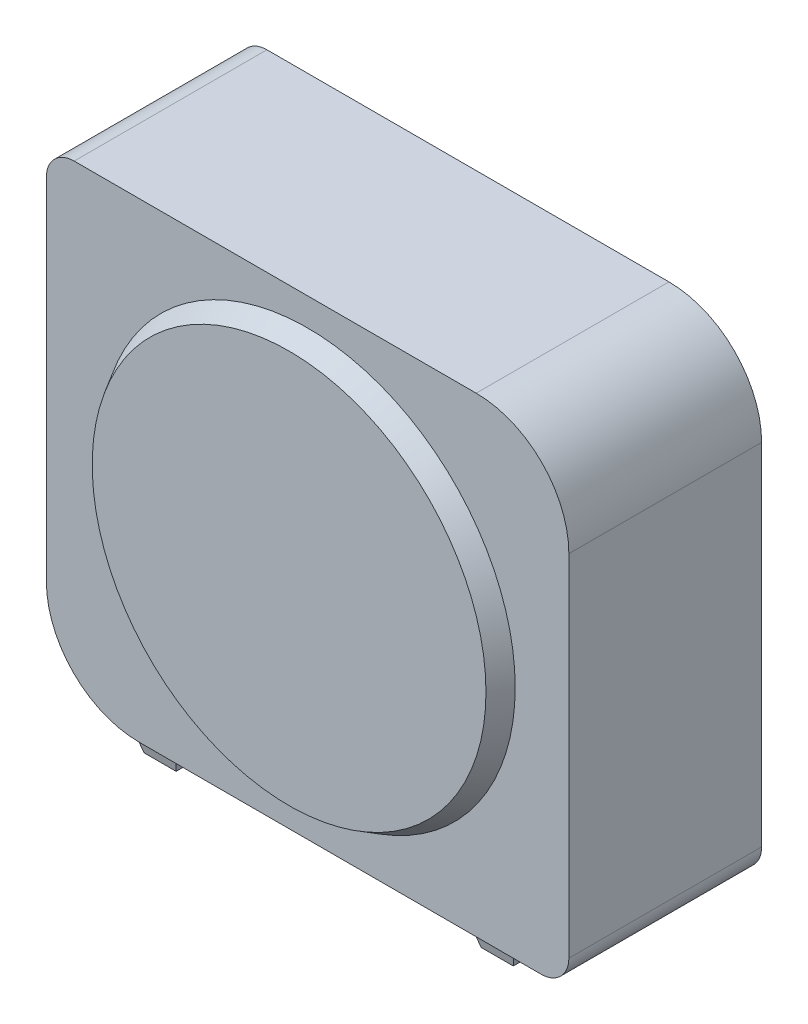
ISO-10303-21;
HEADER;
FILE_DESCRIPTION(('STEP AP214'),'2;1');
FILE_NAME('part.step','',(''),(''),'','','');
FILE_SCHEMA(('AUTOMOTIVE_DESIGN { 1 0 10303 214 1 1 1 1 }'));
ENDSEC;
DATA;
#1=APPLICATION_CONTEXT('core data for automotive mechanical design processes');
#2=APPLICATION_PROTOCOL_DEFINITION('international standard','automotive_design',2000,#1);
#3=PRODUCT_CONTEXT('',#1,'mechanical');
#4=PRODUCT('Part','Part','',(#3));
#5=PRODUCT_RELATED_PRODUCT_CATEGORY('part','',(#4));
#6=PRODUCT_DEFINITION_FORMATION('','',#4);
#7=PRODUCT_DEFINITION_CONTEXT('part definition',#1,'design');
#8=PRODUCT_DEFINITION('design','',#6,#7);
#9=PRODUCT_DEFINITION_SHAPE('','',#8);
#10=(LENGTH_UNIT() NAMED_UNIT(*) SI_UNIT(.MILLI.,.METRE.));
#11=(NAMED_UNIT(*) PLANE_ANGLE_UNIT() SI_UNIT($,.RADIAN.));
#12=(NAMED_UNIT(*) SI_UNIT($,.STERADIAN.) SOLID_ANGLE_UNIT());
#13=UNCERTAINTY_MEASURE_WITH_UNIT(LENGTH_MEASURE(1.E-05),#10,'distance_accuracy_value','');
#14=(GEOMETRIC_REPRESENTATION_CONTEXT(3) GLOBAL_UNCERTAINTY_ASSIGNED_CONTEXT((#13)) GLOBAL_UNIT_ASSIGNED_CONTEXT((#10,
#11,#12)) REPRESENTATION_CONTEXT('',''));
#15=CARTESIAN_POINT('',(0.,0.,0.));
#16=DIRECTION('',(0.,0.,1.));
#17=DIRECTION('',(1.,0.,0.));
#18=AXIS2_PLACEMENT_3D('',#15,#16,#17);
#19=CARTESIAN_POINT('',(0.,0.,104.));
#20=DIRECTION('',(0.,1.,0.));
#21=DIRECTION('',(0.,0.,1.));
#22=AXIS2_PLACEMENT_3D('',#19,#20,#21);
#23=PLANE('',#22);
#24=DIRECTION('',(0.,0.,1.));
#25=VECTOR('',#24,1.);
#26=CARTESIAN_POINT('',(70.,0.,104.));
#27=LINE('',#26,#25);
#28=CARTESIAN_POINT('',(70.,0.,0.));
#29=VERTEX_POINT('',#28);
#30=CARTESIAN_POINT('',(70.,0.,104.));
#31=VERTEX_POINT('',#30);
#32=EDGE_CURVE('E62',#29,#31,#27,.T.);
#33=ORIENTED_EDGE('',*,*,#32,.F.);
#34=DIRECTION('',(1.,0.,0.));
#35=VECTOR('',#34,1.);
#36=CARTESIAN_POINT('',(0.,0.,0.));
#37=LINE('',#36,#35);
#38=CARTESIAN_POINT('',(231.9,0.,0.));
#39=VERTEX_POINT('',#38);
#40=EDGE_CURVE('E153',#29,#39,#37,.T.);
#41=ORIENTED_EDGE('',*,*,#40,.T.);
#42=DIRECTION('',(0.,0.,-1.));
#43=VECTOR('',#42,1.);
#44=CARTESIAN_POINT('',(231.9,0.,104.));
#45=LINE('',#44,#43);
#46=CARTESIAN_POINT('',(231.9,0.,104.));
#47=VERTEX_POINT('',#46);
#48=EDGE_CURVE('E316',#47,#39,#45,.T.);
#49=ORIENTED_EDGE('',*,*,#48,.F.);
#50=DIRECTION('',(1.,0.,0.));
#51=VECTOR('',#50,1.);
#52=CARTESIAN_POINT('',(0.,0.,104.));
#53=LINE('',#52,#51);
#54=EDGE_CURVE('E57',#31,#47,#53,.T.);
#55=ORIENTED_EDGE('',*,*,#54,.F.);
#56=EDGE_LOOP('',(#33,#41,#49,#55));
#57=FACE_BOUND('',#56,.T.);
#58=ADVANCED_FACE('F41',(#57),#23,.F.);
#59=DIRECTION('',(0.,0.,1.));
#60=VECTOR('',#59,1.);
#61=CARTESIAN_POINT('',(251.9,0.,104.));
#62=LINE('',#61,#60);
#63=CARTESIAN_POINT('',(251.9,0.,0.));
#64=VERTEX_POINT('',#63);
#65=CARTESIAN_POINT('',(251.9,0.,104.));
#66=VERTEX_POINT('',#65);
#67=EDGE_CURVE('E179',#64,#66,#62,.T.);
#68=ORIENTED_EDGE('',*,*,#67,.F.);
#69=CARTESIAN_POINT('',(266.9,0.,0.));
#70=VERTEX_POINT('',#69);
#71=EDGE_CURVE('E161',#64,#70,#37,.T.);
#72=ORIENTED_EDGE('',*,*,#71,.T.);
#73=DIRECTION('',(0.,0.,-1.));
#74=VECTOR('',#73,1.);
#75=CARTESIAN_POINT('',(266.9,0.,104.));
#76=LINE('',#75,#74);
#77=CARTESIAN_POINT('',(266.9,0.,104.));
#78=VERTEX_POINT('',#77);
#79=EDGE_CURVE('E190',#70,#78,#76,.F.);
#80=ORIENTED_EDGE('',*,*,#79,.T.);
#81=EDGE_CURVE('E208',#66,#78,#53,.T.);
#82=ORIENTED_EDGE('',*,*,#81,.F.);
#83=EDGE_LOOP('',(#68,#72,#80,#82));
#84=FACE_BOUND('',#83,.T.);
#85=ADVANCED_FACE('F273',(#84),#23,.F.);
#86=CARTESIAN_POINT('',(0.,0.,104.));
#87=DIRECTION('',(1.,0.,0.));
#88=DIRECTION('',(0.,0.,-1.));
#89=AXIS2_PLACEMENT_3D('',#86,#87,#88);
#90=PLANE('',#89);
#91=DIRECTION('',(0.,-1.,0.));
#92=VECTOR('',#91,1.);
#93=CARTESIAN_POINT('',(0.,0.,0.));
#94=LINE('',#93,#92);
#95=CARTESIAN_POINT('',(0.,239.,0.));
#96=VERTEX_POINT('',#95);
#97=CARTESIAN_POINT('',(0.,50.,0.));
#98=VERTEX_POINT('',#97);
#99=EDGE_CURVE('E201',#96,#98,#94,.T.);
#100=ORIENTED_EDGE('',*,*,#99,.T.);
#101=DIRECTION('',(0.,0.,-1.));
#102=VECTOR('',#101,1.);
#103=CARTESIAN_POINT('',(0.,50.,104.));
#104=LINE('',#103,#102);
#105=CARTESIAN_POINT('',(0.,50.,104.));
#106=VERTEX_POINT('',#105);
#107=EDGE_CURVE('E50',#98,#106,#104,.F.);
#108=ORIENTED_EDGE('',*,*,#107,.T.);
#109=DIRECTION('',(0.,-1.,0.));
#110=VECTOR('',#109,1.);
#111=CARTESIAN_POINT('',(0.,0.,104.));
#112=LINE('',#111,#110);
#113=CARTESIAN_POINT('',(0.,239.,104.));
#114=VERTEX_POINT('',#113);
#115=EDGE_CURVE('E199',#114,#106,#112,.T.);
#116=ORIENTED_EDGE('',*,*,#115,.F.);
#117=DIRECTION('',(0.,0.,-1.));
#118=VECTOR('',#117,1.);
#119=CARTESIAN_POINT('',(0.,239.,104.));
#120=LINE('',#119,#118);
#121=EDGE_CURVE('E249',#114,#96,#120,.T.);
#122=ORIENTED_EDGE('',*,*,#121,.T.);
#123=EDGE_LOOP('',(#100,#108,#116,#122));
#124=FACE_BOUND('',#123,.T.);
#125=ADVANCED_FACE('F197',(#124),#90,.F.);
#126=CARTESIAN_POINT('',(281.9,0.,104.));
#127=DIRECTION('',(-1.,0.,0.));
#128=DIRECTION('',(0.,0.,1.));
#129=AXIS2_PLACEMENT_3D('',#126,#127,#128);
#130=PLANE('',#129);
#131=DIRECTION('',(0.,1.,0.));
#132=VECTOR('',#131,1.);
#133=CARTESIAN_POINT('',(281.9,0.,104.));
#134=LINE('',#133,#132);
#135=CARTESIAN_POINT('',(281.9,15.,104.));
#136=VERTEX_POINT('',#135);
#137=CARTESIAN_POINT('',(281.9,204.,104.));
#138=VERTEX_POINT('',#137);
#139=EDGE_CURVE('E222',#136,#138,#134,.T.);
#140=ORIENTED_EDGE('',*,*,#139,.F.);
#141=DIRECTION('',(0.,0.,-1.));
#142=VECTOR('',#141,1.);
#143=CARTESIAN_POINT('',(281.9,15.,104.));
#144=LINE('',#143,#142);
#145=CARTESIAN_POINT('',(281.9,15.,0.));
#146=VERTEX_POINT('',#145);
#147=EDGE_CURVE('E260',#136,#146,#144,.T.);
#148=ORIENTED_EDGE('',*,*,#147,.T.);
#149=DIRECTION('',(0.,1.,0.));
#150=VECTOR('',#149,1.);
#151=CARTESIAN_POINT('',(281.9,0.,0.));
#152=LINE('',#151,#150);
#153=CARTESIAN_POINT('',(281.9,204.,0.));
#154=VERTEX_POINT('',#153);
#155=EDGE_CURVE('E159',#146,#154,#152,.T.);
#156=ORIENTED_EDGE('',*,*,#155,.T.);
#157=DIRECTION('',(0.,0.,-1.));
#158=VECTOR('',#157,1.);
#159=CARTESIAN_POINT('',(281.9,204.,104.));
#160=LINE('',#159,#158);
#161=EDGE_CURVE('E242',#154,#138,#160,.F.);
#162=ORIENTED_EDGE('',*,*,#161,.T.);
#163=EDGE_LOOP('',(#140,#148,#156,#162));
#164=FACE_BOUND('',#163,.T.);
#165=ADVANCED_FACE('F280',(#164),#130,.F.);
#166=CARTESIAN_POINT('',(0.,254.,104.));
#167=DIRECTION('',(0.,-1.,0.));
#168=DIRECTION('',(0.,0.,-1.));
#169=AXIS2_PLACEMENT_3D('',#166,#167,#168);
#170=PLANE('',#169);
#171=DIRECTION('',(-1.,0.,0.));
#172=VECTOR('',#171,1.);
#173=CARTESIAN_POINT('',(0.,254.,0.));
#174=LINE('',#173,#172);
#175=CARTESIAN_POINT('',(231.9,254.,0.));
#176=VERTEX_POINT('',#175);
#177=CARTESIAN_POINT('',(15.,254.,0.));
#178=VERTEX_POINT('',#177);
#179=EDGE_CURVE('E209',#176,#178,#174,.T.);
#180=ORIENTED_EDGE('',*,*,#179,.T.);
#181=DIRECTION('',(0.,0.,-1.));
#182=VECTOR('',#181,1.);
#183=CARTESIAN_POINT('',(15.,254.,104.));
#184=LINE('',#183,#182);
#185=CARTESIAN_POINT('',(15.,254.,104.));
#186=VERTEX_POINT('',#185);
#187=EDGE_CURVE('E255',#178,#186,#184,.F.);
#188=ORIENTED_EDGE('',*,*,#187,.T.);
#189=DIRECTION('',(-1.,0.,0.));
#190=VECTOR('',#189,1.);
#191=CARTESIAN_POINT('',(0.,254.,104.));
#192=LINE('',#191,#190);
#193=CARTESIAN_POINT('',(231.9,254.,104.));
#194=VERTEX_POINT('',#193);
#195=EDGE_CURVE('E225',#194,#186,#192,.T.);
#196=ORIENTED_EDGE('',*,*,#195,.F.);
#197=DIRECTION('',(0.,0.,-1.));
#198=VECTOR('',#197,1.);
#199=CARTESIAN_POINT('',(231.9,254.,104.));
#200=LINE('',#199,#198);
#201=EDGE_CURVE('E233',#194,#176,#200,.T.);
#202=ORIENTED_EDGE('',*,*,#201,.T.);
#203=EDGE_LOOP('',(#180,#188,#196,#202));
#204=FACE_BOUND('',#203,.T.);
#205=ADVANCED_FACE('F289',(#204),#170,.F.);
#206=CARTESIAN_POINT('',(0.,0.,104.));
#207=DIRECTION('',(0.,0.,-1.));
#208=DIRECTION('',(-1.,0.,0.));
#209=AXIS2_PLACEMENT_3D('',#206,#207,#208);
#210=PLANE('',#209);
#211=CARTESIAN_POINT('',(140.95,127.,104.));
#212=DIRECTION('',(0.,0.,1.));
#213=DIRECTION('',(1.,0.,0.));
#214=AXIS2_PLACEMENT_3D('',#211,#212,#213);
#215=CIRCLE('',#214,112.);
#216=CARTESIAN_POINT('',(252.95,127.,104.));
#217=VERTEX_POINT('',#216);
#218=EDGE_CURVE('E228',#217,#217,#215,.T.);
#219=ORIENTED_EDGE('',*,*,#218,.F.);
#220=EDGE_LOOP('',(#219));
#221=FACE_BOUND('',#220,.T.);
#222=ORIENTED_EDGE('',*,*,#115,.T.);
#223=CARTESIAN_POINT('',(50.,50.,104.));
#224=DIRECTION('',(0.,0.,-1.));
#225=DIRECTION('',(-1.,0.,0.));
#226=AXIS2_PLACEMENT_3D('',#223,#224,#225);
#227=CIRCLE('',#226,50.);
#228=CARTESIAN_POINT('',(50.,0.,104.));
#229=VERTEX_POINT('',#228);
#230=EDGE_CURVE('E11',#106,#229,#227,.F.);
#231=ORIENTED_EDGE('',*,*,#230,.T.);
#232=EDGE_CURVE('E214',#229,#31,#53,.T.);
#233=ORIENTED_EDGE('',*,*,#232,.T.);
#234=ORIENTED_EDGE('',*,*,#54,.T.);
#235=DIRECTION('',(-1.,0.,0.));
#236=VECTOR('',#235,1.);
#237=CARTESIAN_POINT('',(251.9,0.,104.));
#238=LINE('',#237,#236);
#239=EDGE_CURVE('E303',#66,#47,#238,.T.);
#240=ORIENTED_EDGE('',*,*,#239,.F.);
#241=ORIENTED_EDGE('',*,*,#81,.T.);
#242=CARTESIAN_POINT('',(266.9,15.,104.));
#243=DIRECTION('',(0.,0.,-1.));
#244=DIRECTION('',(-1.,0.,0.));
#245=AXIS2_PLACEMENT_3D('',#242,#243,#244);
#246=CIRCLE('',#245,15.);
#247=EDGE_CURVE('E187',#78,#136,#246,.F.);
#248=ORIENTED_EDGE('',*,*,#247,.T.);
#249=ORIENTED_EDGE('',*,*,#139,.T.);
#250=CARTESIAN_POINT('',(231.9,204.,104.));
#251=DIRECTION('',(0.,0.,-1.));
#252=DIRECTION('',(-1.,0.,0.));
#253=AXIS2_PLACEMENT_3D('',#250,#251,#252);
#254=CIRCLE('',#253,50.);
#255=EDGE_CURVE('E246',#138,#194,#254,.F.);
#256=ORIENTED_EDGE('',*,*,#255,.T.);
#257=ORIENTED_EDGE('',*,*,#195,.T.);
#258=CARTESIAN_POINT('',(15.,239.,104.));
#259=DIRECTION('',(0.,0.,-1.));
#260=DIRECTION('',(-1.,0.,0.));
#261=AXIS2_PLACEMENT_3D('',#258,#259,#260);
#262=CIRCLE('',#261,15.);
#263=EDGE_CURVE('E206',#186,#114,#262,.F.);
#264=ORIENTED_EDGE('',*,*,#263,.T.);
#265=EDGE_LOOP('',(#222,#231,#233,#234,#240,#241,#248,#249,#256,#257,#264));
#266=FACE_BOUND('',#265,.T.);
#267=ADVANCED_FACE('F203',(#221,#266),#210,.F.);
#268=CARTESIAN_POINT('',(0.,0.,0.));
#269=DIRECTION('',(0.,0.,-1.));
#270=DIRECTION('',(-1.,0.,0.));
#271=AXIS2_PLACEMENT_3D('',#268,#269,#270);
#272=PLANE('',#271);
#273=CARTESIAN_POINT('',(140.95,127.,0.));
#274=DIRECTION('',(0.,0.,-1.));
#275=DIRECTION('',(-1.,0.,0.));
#276=AXIS2_PLACEMENT_3D('',#273,#274,#275);
#277=CIRCLE('',#276,112.);
#278=CARTESIAN_POINT('',(28.9500000000001,127.,0.));
#279=VERTEX_POINT('',#278);
#280=EDGE_CURVE('E238',#279,#279,#277,.T.);
#281=ORIENTED_EDGE('',*,*,#280,.F.);
#282=EDGE_LOOP('',(#281));
#283=FACE_BOUND('',#282,.T.);
#284=CARTESIAN_POINT('',(50.,0.,0.));
#285=VERTEX_POINT('',#284);
#286=EDGE_CURVE('E146',#285,#29,#37,.T.);
#287=ORIENTED_EDGE('',*,*,#286,.F.);
#288=CARTESIAN_POINT('',(50.,50.,0.));
#289=DIRECTION('',(0.,0.,-1.));
#290=DIRECTION('',(-1.,0.,0.));
#291=AXIS2_PLACEMENT_3D('',#288,#289,#290);
#292=CIRCLE('',#291,50.);
#293=EDGE_CURVE('E150',#285,#98,#292,.T.);
#294=ORIENTED_EDGE('',*,*,#293,.T.);
#295=ORIENTED_EDGE('',*,*,#99,.F.);
#296=CARTESIAN_POINT('',(15.,239.,0.));
#297=DIRECTION('',(0.,0.,-1.));
#298=DIRECTION('',(-1.,0.,0.));
#299=AXIS2_PLACEMENT_3D('',#296,#297,#298);
#300=CIRCLE('',#299,15.);
#301=EDGE_CURVE('E252',#96,#178,#300,.T.);
#302=ORIENTED_EDGE('',*,*,#301,.T.);
#303=ORIENTED_EDGE('',*,*,#179,.F.);
#304=CARTESIAN_POINT('',(231.9,204.,0.));
#305=DIRECTION('',(0.,0.,-1.));
#306=DIRECTION('',(-1.,0.,0.));
#307=AXIS2_PLACEMENT_3D('',#304,#305,#306);
#308=CIRCLE('',#307,50.);
#309=EDGE_CURVE('E237',#176,#154,#308,.T.);
#310=ORIENTED_EDGE('',*,*,#309,.T.);
#311=ORIENTED_EDGE('',*,*,#155,.F.);
#312=CARTESIAN_POINT('',(266.9,15.,0.));
#313=DIRECTION('',(0.,0.,-1.));
#314=DIRECTION('',(-1.,0.,0.));
#315=AXIS2_PLACEMENT_3D('',#312,#313,#314);
#316=CIRCLE('',#315,15.);
#317=EDGE_CURVE('E264',#146,#70,#316,.T.);
#318=ORIENTED_EDGE('',*,*,#317,.T.);
#319=ORIENTED_EDGE('',*,*,#71,.F.);
#320=DIRECTION('',(1.,0.,0.));
#321=VECTOR('',#320,1.);
#322=CARTESIAN_POINT('',(251.9,0.,0.));
#323=LINE('',#322,#321);
#324=EDGE_CURVE('E295',#39,#64,#323,.T.);
#325=ORIENTED_EDGE('',*,*,#324,.F.);
#326=ORIENTED_EDGE('',*,*,#40,.F.);
#327=EDGE_LOOP('',(#287,#294,#295,#302,#303,#310,#311,#318,#319,#325,#326));
#328=FACE_BOUND('',#327,.T.);
#329=ADVANCED_FACE('F148',(#283,#328),#272,.T.);
#330=CARTESIAN_POINT('',(140.95,127.,104.));
#331=DIRECTION('',(0.,0.,-1.));
#332=DIRECTION('',(1.,0.,0.));
#333=AXIS2_PLACEMENT_3D('',#330,#331,#332);
#334=CONICAL_SURFACE('',#333,112.,0.5235987755983);
#335=CARTESIAN_POINT('',(140.95,127.,114.));
#336=DIRECTION('',(0.,0.,1.));
#337=DIRECTION('',(1.,0.,0.));
#338=AXIS2_PLACEMENT_3D('',#335,#336,#337);
#339=CIRCLE('',#338,106.226497308104);
#340=CARTESIAN_POINT('',(247.176497308104,127.,114.));
#341=VERTEX_POINT('',#340);
#342=EDGE_CURVE('E218',#341,#341,#339,.T.);
#343=ORIENTED_EDGE('',*,*,#342,.F.);
#344=EDGE_LOOP('',(#343));
#345=FACE_BOUND('',#344,.T.);
#346=ORIENTED_EDGE('',*,*,#218,.T.);
#347=EDGE_LOOP('',(#346));
#348=FACE_BOUND('',#347,.T.);
#349=ADVANCED_FACE('F352',(#345,#348),#334,.T.);
#350=CARTESIAN_POINT('',(140.95,127.,114.));
#351=DIRECTION('',(0.,0.,1.));
#352=DIRECTION('',(1.,0.,0.));
#353=AXIS2_PLACEMENT_3D('',#350,#351,#352);
#354=PLANE('',#353);
#355=ORIENTED_EDGE('',*,*,#342,.T.);
#356=EDGE_LOOP('',(#355));
#357=FACE_BOUND('',#356,.T.);
#358=ADVANCED_FACE('F407',(#357),#354,.T.);
#359=CARTESIAN_POINT('',(140.95,127.,0.));
#360=DIRECTION('',(0.,0.,1.));
#361=DIRECTION('',(-1.,0.,0.));
#362=AXIS2_PLACEMENT_3D('',#359,#360,#361);
#363=CONICAL_SURFACE('',#362,112.,0.5235987755983);
#364=CARTESIAN_POINT('',(140.95,127.,-10.));
#365=DIRECTION('',(0.,0.,-1.));
#366=DIRECTION('',(-1.,0.,0.));
#367=AXIS2_PLACEMENT_3D('',#364,#365,#366);
#368=CIRCLE('',#367,106.226497308104);
#369=CARTESIAN_POINT('',(34.7235026918964,127.,-10.));
#370=VERTEX_POINT('',#369);
#371=EDGE_CURVE('E345',#370,#370,#368,.T.);
#372=ORIENTED_EDGE('',*,*,#371,.F.);
#373=EDGE_LOOP('',(#372));
#374=FACE_BOUND('',#373,.T.);
#375=ORIENTED_EDGE('',*,*,#280,.T.);
#376=EDGE_LOOP('',(#375));
#377=FACE_BOUND('',#376,.T.);
#378=ADVANCED_FACE('F403',(#374,#377),#363,.T.);
#379=CARTESIAN_POINT('',(140.95,127.,-10.));
#380=DIRECTION('',(0.,0.,-1.));
#381=DIRECTION('',(-1.,0.,0.));
#382=AXIS2_PLACEMENT_3D('',#379,#380,#381);
#383=PLANE('',#382);
#384=ORIENTED_EDGE('',*,*,#371,.T.);
#385=EDGE_LOOP('',(#384));
#386=FACE_BOUND('',#385,.T.);
#387=ADVANCED_FACE('F375',(#386),#383,.T.);
#388=CARTESIAN_POINT('',(231.9,204.,104.));
#389=DIRECTION('',(0.,0.,-1.));
#390=DIRECTION('',(-1.,0.,0.));
#391=AXIS2_PLACEMENT_3D('',#388,#389,#390);
#392=CYLINDRICAL_SURFACE('',#391,50.);
#393=ORIENTED_EDGE('',*,*,#255,.F.);
#394=ORIENTED_EDGE('',*,*,#161,.F.);
#395=ORIENTED_EDGE('',*,*,#309,.F.);
#396=ORIENTED_EDGE('',*,*,#201,.F.);
#397=EDGE_LOOP('',(#393,#394,#395,#396));
#398=FACE_BOUND('',#397,.T.);
#399=ADVANCED_FACE('F286',(#398),#392,.T.);
#400=CARTESIAN_POINT('',(15.,239.,104.));
#401=DIRECTION('',(0.,0.,-1.));
#402=DIRECTION('',(-1.,0.,0.));
#403=AXIS2_PLACEMENT_3D('',#400,#401,#402);
#404=CYLINDRICAL_SURFACE('',#403,15.);
#405=ORIENTED_EDGE('',*,*,#263,.F.);
#406=ORIENTED_EDGE('',*,*,#187,.F.);
#407=ORIENTED_EDGE('',*,*,#301,.F.);
#408=ORIENTED_EDGE('',*,*,#121,.F.);
#409=EDGE_LOOP('',(#405,#406,#407,#408));
#410=FACE_BOUND('',#409,.T.);
#411=ADVANCED_FACE('F293',(#410),#404,.T.);
#412=CARTESIAN_POINT('',(266.9,15.,104.));
#413=DIRECTION('',(0.,0.,-1.));
#414=DIRECTION('',(-1.,0.,0.));
#415=AXIS2_PLACEMENT_3D('',#412,#413,#414);
#416=CYLINDRICAL_SURFACE('',#415,15.);
#417=ORIENTED_EDGE('',*,*,#247,.F.);
#418=ORIENTED_EDGE('',*,*,#79,.F.);
#419=ORIENTED_EDGE('',*,*,#317,.F.);
#420=ORIENTED_EDGE('',*,*,#147,.F.);
#421=EDGE_LOOP('',(#417,#418,#419,#420));
#422=FACE_BOUND('',#421,.T.);
#423=ADVANCED_FACE('F277',(#422),#416,.T.);
#424=CARTESIAN_POINT('',(50.,50.,104.));
#425=DIRECTION('',(0.,0.,-1.));
#426=DIRECTION('',(-1.,0.,0.));
#427=AXIS2_PLACEMENT_3D('',#424,#425,#426);
#428=CYLINDRICAL_SURFACE('',#427,50.);
#429=ORIENTED_EDGE('',*,*,#230,.F.);
#430=ORIENTED_EDGE('',*,*,#107,.F.);
#431=ORIENTED_EDGE('',*,*,#293,.F.);
#432=DIRECTION('',(0.,0.,-1.));
#433=VECTOR('',#432,1.);
#434=CARTESIAN_POINT('',(50.,0.,104.));
#435=LINE('',#434,#433);
#436=EDGE_CURVE('E167',#229,#285,#435,.T.);
#437=ORIENTED_EDGE('',*,*,#436,.F.);
#438=EDGE_LOOP('',(#429,#430,#431,#437));
#439=FACE_BOUND('',#438,.T.);
#440=ADVANCED_FACE('F43',(#439),#428,.T.);
#441=CARTESIAN_POINT('',(251.9,0.,104.));
#442=DIRECTION('',(0.965925826289068,-0.258819045102521,0.));
#443=DIRECTION('',(0.258819045102521,0.965925826289068,0.));
#444=AXIS2_PLACEMENT_3D('',#441,#442,#443);
#445=PLANE('',#444);
#446=ORIENTED_EDGE('',*,*,#67,.T.);
#447=DIRECTION('',(0.250562807085732,0.935113126531029,0.250562807085732));
#448=VECTOR('',#447,1.);
#449=CARTESIAN_POINT('',(251.9,0.,104.));
#450=LINE('',#449,#448);
#451=CARTESIAN_POINT('',(250.560254037845,-5.,102.660254037844));
#452=VERTEX_POINT('',#451);
#453=EDGE_CURVE('E330',#452,#66,#450,.T.);
#454=ORIENTED_EDGE('',*,*,#453,.F.);
#455=DIRECTION('',(0.,0.,-1.));
#456=VECTOR('',#455,1.);
#457=CARTESIAN_POINT('',(250.560254037845,-5.,0.));
#458=LINE('',#457,#456);
#459=CARTESIAN_POINT('',(250.560254037845,-5.,1.33974596215562));
#460=VERTEX_POINT('',#459);
#461=EDGE_CURVE('E315',#460,#452,#458,.F.);
#462=ORIENTED_EDGE('',*,*,#461,.F.);
#463=DIRECTION('',(0.250562807085732,0.935113126531029,-0.250562807085732));
#464=VECTOR('',#463,1.);
#465=CARTESIAN_POINT('',(245.370701089353,-24.3676752723383,6.52929891064691));
#466=LINE('',#465,#464);
#467=EDGE_CURVE('E310',#460,#64,#466,.T.);
#468=ORIENTED_EDGE('',*,*,#467,.T.);
#469=EDGE_LOOP('',(#446,#454,#462,#468));
#470=FACE_BOUND('',#469,.T.);
#471=ADVANCED_FACE('F318',(#470),#445,.T.);
#472=CARTESIAN_POINT('',(251.9,0.,104.));
#473=DIRECTION('',(0.,-0.258819045102521,0.965925826289068));
#474=DIRECTION('',(0.,-0.965925826289068,-0.258819045102521));
#475=AXIS2_PLACEMENT_3D('',#472,#473,#474);
#476=PLANE('',#475);
#477=ORIENTED_EDGE('',*,*,#239,.T.);
#478=DIRECTION('',(-0.250562807085732,0.935113126531029,0.250562807085732));
#479=VECTOR('',#478,1.);
#480=CARTESIAN_POINT('',(231.9,0.,104.));
#481=LINE('',#480,#479);
#482=CARTESIAN_POINT('',(233.239745962156,-5.,102.660254037844));
#483=VERTEX_POINT('',#482);
#484=EDGE_CURVE('E325',#483,#47,#481,.T.);
#485=ORIENTED_EDGE('',*,*,#484,.F.);
#486=DIRECTION('',(1.,0.,0.));
#487=VECTOR('',#486,1.);
#488=CARTESIAN_POINT('',(0.,-5.,102.660254037844));
#489=LINE('',#488,#487);
#490=EDGE_CURVE('E337',#452,#483,#489,.F.);
#491=ORIENTED_EDGE('',*,*,#490,.F.);
#492=ORIENTED_EDGE('',*,*,#453,.T.);
#493=EDGE_LOOP('',(#477,#485,#491,#492));
#494=FACE_BOUND('',#493,.T.);
#495=ADVANCED_FACE('F384',(#494),#476,.T.);
#496=CARTESIAN_POINT('',(231.9,0.,104.));
#497=DIRECTION('',(-0.965925826289068,-0.258819045102521,0.));
#498=DIRECTION('',(0.258819045102521,-0.965925826289068,0.));
#499=AXIS2_PLACEMENT_3D('',#496,#497,#498);
#500=PLANE('',#499);
#501=ORIENTED_EDGE('',*,*,#48,.T.);
#502=DIRECTION('',(-0.250562807085732,0.935113126531029,-0.250562807085732));
#503=VECTOR('',#502,1.);
#504=CARTESIAN_POINT('',(233.155634405894,-4.68609139852659,1.25563440589363));
#505=LINE('',#504,#503);
#506=CARTESIAN_POINT('',(233.239745962156,-5.,1.33974596215562));
#507=VERTEX_POINT('',#506);
#508=EDGE_CURVE('E313',#507,#39,#505,.T.);
#509=ORIENTED_EDGE('',*,*,#508,.F.);
#510=DIRECTION('',(0.,0.,1.));
#511=VECTOR('',#510,1.);
#512=CARTESIAN_POINT('',(233.239745962156,-5.,0.));
#513=LINE('',#512,#511);
#514=EDGE_CURVE('E327',#483,#507,#513,.F.);
#515=ORIENTED_EDGE('',*,*,#514,.F.);
#516=ORIENTED_EDGE('',*,*,#484,.T.);
#517=EDGE_LOOP('',(#501,#509,#515,#516));
#518=FACE_BOUND('',#517,.T.);
#519=ADVANCED_FACE('F389',(#518),#500,.T.);
#520=CARTESIAN_POINT('',(251.9,0.,0.));
#521=DIRECTION('',(0.,-0.258819045102521,-0.965925826289068));
#522=DIRECTION('',(0.,0.965925826289068,-0.258819045102521));
#523=AXIS2_PLACEMENT_3D('',#520,#521,#522);
#524=PLANE('',#523);
#525=ORIENTED_EDGE('',*,*,#324,.T.);
#526=ORIENTED_EDGE('',*,*,#467,.F.);
#527=DIRECTION('',(-1.,0.,0.));
#528=VECTOR('',#527,1.);
#529=CARTESIAN_POINT('',(0.,-5.,1.3397459621556));
#530=LINE('',#529,#528);
#531=EDGE_CURVE('E321',#507,#460,#530,.F.);
#532=ORIENTED_EDGE('',*,*,#531,.F.);
#533=ORIENTED_EDGE('',*,*,#508,.T.);
#534=EDGE_LOOP('',(#525,#526,#532,#533));
#535=FACE_BOUND('',#534,.T.);
#536=ADVANCED_FACE('F308',(#535),#524,.T.);
#537=CARTESIAN_POINT('',(0.,-5.,0.));
#538=DIRECTION('',(0.,1.,0.));
#539=DIRECTION('',(0.,0.,1.));
#540=AXIS2_PLACEMENT_3D('',#537,#538,#539);
#541=PLANE('',#540);
#542=ORIENTED_EDGE('',*,*,#461,.T.);
#543=ORIENTED_EDGE('',*,*,#490,.T.);
#544=ORIENTED_EDGE('',*,*,#514,.T.);
#545=ORIENTED_EDGE('',*,*,#531,.T.);
#546=EDGE_LOOP('',(#542,#543,#544,#545));
#547=FACE_BOUND('',#546,.T.);
#548=ADVANCED_FACE('F394',(#547),#541,.F.);
#549=CARTESIAN_POINT('',(50.,0.,104.));
#550=DIRECTION('',(-0.965925826289068,-0.258819045102521,0.));
#551=DIRECTION('',(0.258819045102521,-0.965925826289068,0.));
#552=AXIS2_PLACEMENT_3D('',#549,#550,#551);
#553=PLANE('',#552);
#554=ORIENTED_EDGE('',*,*,#436,.T.);
#555=DIRECTION('',(-0.250562807085732,0.935113126531029,-0.250562807085732));
#556=VECTOR('',#555,1.);
#557=CARTESIAN_POINT('',(50.,0.,0.));
#558=LINE('',#557,#556);
#559=CARTESIAN_POINT('',(51.3397459621556,-5.,1.33974596215562));
#560=VERTEX_POINT('',#559);
#561=EDGE_CURVE('E172',#560,#285,#558,.T.);
#562=ORIENTED_EDGE('',*,*,#561,.F.);
#563=DIRECTION('',(0.,0.,1.));
#564=VECTOR('',#563,1.);
#565=CARTESIAN_POINT('',(51.3397459621556,-5.,104.));
#566=LINE('',#565,#564);
#567=CARTESIAN_POINT('',(51.3397459621556,-5.,102.660254037844));
#568=VERTEX_POINT('',#567);
#569=EDGE_CURVE('E437',#568,#560,#566,.F.);
#570=ORIENTED_EDGE('',*,*,#569,.F.);
#571=DIRECTION('',(-0.250562807085732,0.935113126531029,0.250562807085732));
#572=VECTOR('',#571,1.);
#573=CARTESIAN_POINT('',(50.,0.,104.));
#574=LINE('',#573,#572);
#575=EDGE_CURVE('E185',#568,#229,#574,.T.);
#576=ORIENTED_EDGE('',*,*,#575,.T.);
#577=EDGE_LOOP('',(#554,#562,#570,#576));
#578=FACE_BOUND('',#577,.T.);
#579=ADVANCED_FACE('F183',(#578),#553,.T.);
#580=CARTESIAN_POINT('',(50.,0.,0.));
#581=DIRECTION('',(0.,-0.258819045102521,-0.965925826289068));
#582=DIRECTION('',(0.,0.965925826289068,-0.258819045102521));
#583=AXIS2_PLACEMENT_3D('',#580,#581,#582);
#584=PLANE('',#583);
#585=ORIENTED_EDGE('',*,*,#286,.T.);
#586=DIRECTION('',(0.250562807085732,0.935113126531029,-0.250562807085732));
#587=VECTOR('',#586,1.);
#588=CARTESIAN_POINT('',(63.4707010893531,-24.3676752723383,6.52929891064691));
#589=LINE('',#588,#587);
#590=CARTESIAN_POINT('',(68.6602540378444,-5.,1.33974596215562));
#591=VERTEX_POINT('',#590);
#592=EDGE_CURVE('E180',#591,#29,#589,.T.);
#593=ORIENTED_EDGE('',*,*,#592,.F.);
#594=DIRECTION('',(-1.,0.,0.));
#595=VECTOR('',#594,1.);
#596=CARTESIAN_POINT('',(50.,-5.,1.33974596215562));
#597=LINE('',#596,#595);
#598=EDGE_CURVE('E174',#560,#591,#597,.F.);
#599=ORIENTED_EDGE('',*,*,#598,.F.);
#600=ORIENTED_EDGE('',*,*,#561,.T.);
#601=EDGE_LOOP('',(#585,#593,#599,#600));
#602=FACE_BOUND('',#601,.T.);
#603=ADVANCED_FACE('F173',(#602),#584,.T.);
#604=CARTESIAN_POINT('',(70.,0.,104.));
#605=DIRECTION('',(0.965925826289068,-0.258819045102521,0.));
#606=DIRECTION('',(0.258819045102521,0.965925826289068,0.));
#607=AXIS2_PLACEMENT_3D('',#604,#605,#606);
#608=PLANE('',#607);
#609=ORIENTED_EDGE('',*,*,#32,.T.);
#610=DIRECTION('',(0.250562807085732,0.935113126531029,0.250562807085732));
#611=VECTOR('',#610,1.);
#612=CARTESIAN_POINT('',(68.7443655941064,-4.6860913985266,102.744365594106));
#613=LINE('',#612,#611);
#614=CARTESIAN_POINT('',(68.6602540378444,-5.,102.660254037844));
#615=VERTEX_POINT('',#614);
#616=EDGE_CURVE('E442',#615,#31,#613,.T.);
#617=ORIENTED_EDGE('',*,*,#616,.F.);
#618=DIRECTION('',(0.,0.,-1.));
#619=VECTOR('',#618,1.);
#620=CARTESIAN_POINT('',(68.6602540378444,-5.,104.));
#621=LINE('',#620,#619);
#622=EDGE_CURVE('E432',#591,#615,#621,.F.);
#623=ORIENTED_EDGE('',*,*,#622,.F.);
#624=ORIENTED_EDGE('',*,*,#592,.T.);
#625=EDGE_LOOP('',(#609,#617,#623,#624));
#626=FACE_BOUND('',#625,.T.);
#627=ADVANCED_FACE('F451',(#626),#608,.T.);
#628=CARTESIAN_POINT('',(50.,0.,104.));
#629=DIRECTION('',(0.,-0.258819045102521,0.965925826289068));
#630=DIRECTION('',(0.,-0.965925826289068,-0.258819045102521));
#631=AXIS2_PLACEMENT_3D('',#628,#629,#630);
#632=PLANE('',#631);
#633=ORIENTED_EDGE('',*,*,#232,.F.);
#634=ORIENTED_EDGE('',*,*,#575,.F.);
#635=DIRECTION('',(1.,0.,0.));
#636=VECTOR('',#635,1.);
#637=CARTESIAN_POINT('',(50.,-5.,102.660254037844));
#638=LINE('',#637,#636);
#639=EDGE_CURVE('E429',#615,#568,#638,.F.);
#640=ORIENTED_EDGE('',*,*,#639,.F.);
#641=ORIENTED_EDGE('',*,*,#616,.T.);
#642=EDGE_LOOP('',(#633,#634,#640,#641));
#643=FACE_BOUND('',#642,.T.);
#644=ADVANCED_FACE('F455',(#643),#632,.T.);
#645=CARTESIAN_POINT('',(0.,-5.,0.));
#646=DIRECTION('',(0.,-1.,0.));
#647=DIRECTION('',(0.,0.,-1.));
#648=AXIS2_PLACEMENT_3D('',#645,#646,#647);
#649=PLANE('',#648);
#650=ORIENTED_EDGE('',*,*,#569,.T.);
#651=ORIENTED_EDGE('',*,*,#598,.T.);
#652=ORIENTED_EDGE('',*,*,#622,.T.);
#653=ORIENTED_EDGE('',*,*,#639,.T.);
#654=EDGE_LOOP('',(#650,#651,#652,#653));
#655=FACE_BOUND('',#654,.T.);
#656=ADVANCED_FACE('F457',(#655),#649,.T.);
#657=CLOSED_SHELL('',(#58,#85,#125,#165,#205,#267,#329,#349,#358,#378,#387,#399,#411,#423,#440,
#471,#495,#519,#536,#548,#579,#603,#627,#644,#656));
#658=MANIFOLD_SOLID_BREP('B2',#657);
#659=ADVANCED_BREP_SHAPE_REPRESENTATION('',(#18,#658),#14);
#660=SHAPE_DEFINITION_REPRESENTATION(#9,#659);
ENDSEC;
END-ISO-10303-21;
